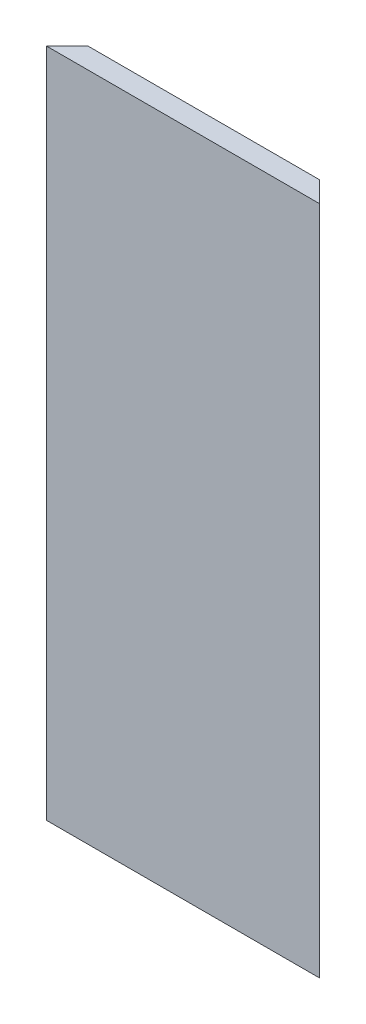
ISO-10303-21;
HEADER;
FILE_DESCRIPTION(('STEP AP214'),'2;1');
FILE_NAME('part.step','',(''),(''),'','','');
FILE_SCHEMA(('AUTOMOTIVE_DESIGN { 1 0 10303 214 1 1 1 1 }'));
ENDSEC;
DATA;
#1=APPLICATION_CONTEXT('core data for automotive mechanical design processes');
#2=APPLICATION_PROTOCOL_DEFINITION('international standard','automotive_design',2000,#1);
#3=PRODUCT_CONTEXT('',#1,'mechanical');
#4=PRODUCT('Part','Part','',(#3));
#5=PRODUCT_RELATED_PRODUCT_CATEGORY('part','',(#4));
#6=PRODUCT_DEFINITION_FORMATION('','',#4);
#7=PRODUCT_DEFINITION_CONTEXT('part definition',#1,'design');
#8=PRODUCT_DEFINITION('design','',#6,#7);
#9=PRODUCT_DEFINITION_SHAPE('','',#8);
#10=(LENGTH_UNIT() NAMED_UNIT(*) SI_UNIT(.MILLI.,.METRE.));
#11=(NAMED_UNIT(*) PLANE_ANGLE_UNIT() SI_UNIT($,.RADIAN.));
#12=(NAMED_UNIT(*) SI_UNIT($,.STERADIAN.) SOLID_ANGLE_UNIT());
#13=UNCERTAINTY_MEASURE_WITH_UNIT(LENGTH_MEASURE(1.E-05),#10,'distance_accuracy_value','');
#14=(GEOMETRIC_REPRESENTATION_CONTEXT(3) GLOBAL_UNCERTAINTY_ASSIGNED_CONTEXT((#13)) GLOBAL_UNIT_ASSIGNED_CONTEXT((#10,
#11,#12)) REPRESENTATION_CONTEXT('',''));
#15=CARTESIAN_POINT('',(0.,0.,0.));
#16=DIRECTION('',(0.,0.,1.));
#17=DIRECTION('',(1.,0.,0.));
#18=AXIS2_PLACEMENT_3D('',#15,#16,#17);
#19=CARTESIAN_POINT('',(-11.2,55.,0.850000000000001));
#20=DIRECTION('',(-0.707106781186549,0.,-0.707106781186546));
#21=DIRECTION('',(-0.707106781186546,0.,0.707106781186549));
#22=AXIS2_PLACEMENT_3D('',#19,#20,#21);
#23=PLANE('',#22);
#24=DIRECTION('',(0.707106781186546,0.,-0.707106781186549));
#25=VECTOR('',#24,1.);
#26=CARTESIAN_POINT('',(-11.2,0.,0.850000000000001));
#27=LINE('',#26,#25);
#28=CARTESIAN_POINT('',(-11.2,0.,0.850000000000001));
#29=VERTEX_POINT('',#28);
#30=CARTESIAN_POINT('',(-9.50000000000001,0.,-0.85));
#31=VERTEX_POINT('',#30);
#32=EDGE_CURVE('E98',#29,#31,#27,.T.);
#33=ORIENTED_EDGE('',*,*,#32,.F.);
#34=DIRECTION('',(0.,-1.,0.));
#35=VECTOR('',#34,1.);
#36=CARTESIAN_POINT('',(-11.2,55.,0.850000000000001));
#37=LINE('',#36,#35);
#38=CARTESIAN_POINT('',(-11.2,55.,0.850000000000001));
#39=VERTEX_POINT('',#38);
#40=EDGE_CURVE('E11',#39,#29,#37,.T.);
#41=ORIENTED_EDGE('',*,*,#40,.F.);
#42=DIRECTION('',(0.707106781186546,0.,-0.707106781186549));
#43=VECTOR('',#42,1.);
#44=CARTESIAN_POINT('',(-11.2,55.,0.850000000000001));
#45=LINE('',#44,#43);
#46=CARTESIAN_POINT('',(-9.50000000000001,55.,-0.85));
#47=VERTEX_POINT('',#46);
#48=EDGE_CURVE('E93',#39,#47,#45,.T.);
#49=ORIENTED_EDGE('',*,*,#48,.T.);
#50=DIRECTION('',(0.,-1.,0.));
#51=VECTOR('',#50,1.);
#52=CARTESIAN_POINT('',(-9.50000000000001,55.,-0.85));
#53=LINE('',#52,#51);
#54=EDGE_CURVE('E36',#47,#31,#53,.T.);
#55=ORIENTED_EDGE('',*,*,#54,.T.);
#56=EDGE_LOOP('',(#33,#41,#49,#55));
#57=FACE_BOUND('',#56,.T.);
#58=ADVANCED_FACE('F33',(#57),#23,.T.);
#59=CARTESIAN_POINT('',(-11.2,55.,0.850000000000001));
#60=DIRECTION('',(0.,0.,-1.));
#61=DIRECTION('',(-1.,0.,0.));
#62=AXIS2_PLACEMENT_3D('',#59,#60,#61);
#63=PLANE('',#62);
#64=DIRECTION('',(1.,0.,0.));
#65=VECTOR('',#64,1.);
#66=CARTESIAN_POINT('',(-11.2,0.,0.850000000000001));
#67=LINE('',#66,#65);
#68=CARTESIAN_POINT('',(11.2,0.,0.850000000000001));
#69=VERTEX_POINT('',#68);
#70=EDGE_CURVE('E66',#29,#69,#67,.T.);
#71=ORIENTED_EDGE('',*,*,#70,.T.);
#72=DIRECTION('',(0.,-1.,0.));
#73=VECTOR('',#72,1.);
#74=CARTESIAN_POINT('',(11.2,55.,0.850000000000001));
#75=LINE('',#74,#73);
#76=CARTESIAN_POINT('',(11.2,55.,0.850000000000001));
#77=VERTEX_POINT('',#76);
#78=EDGE_CURVE('E42',#77,#69,#75,.T.);
#79=ORIENTED_EDGE('',*,*,#78,.F.);
#80=DIRECTION('',(1.,0.,0.));
#81=VECTOR('',#80,1.);
#82=CARTESIAN_POINT('',(-11.2,55.,0.850000000000001));
#83=LINE('',#82,#81);
#84=EDGE_CURVE('E83',#39,#77,#83,.T.);
#85=ORIENTED_EDGE('',*,*,#84,.F.);
#86=ORIENTED_EDGE('',*,*,#40,.T.);
#87=EDGE_LOOP('',(#71,#79,#85,#86));
#88=FACE_BOUND('',#87,.T.);
#89=ADVANCED_FACE('F108',(#88),#63,.F.);
#90=CARTESIAN_POINT('',(11.2,55.,0.850000000000001));
#91=DIRECTION('',(-0.707106781186544,0.,0.707106781186552));
#92=DIRECTION('',(0.707106781186551,0.,0.707106781186544));
#93=AXIS2_PLACEMENT_3D('',#90,#91,#92);
#94=PLANE('',#93);
#95=DIRECTION('',(-0.707106781186551,0.,-0.707106781186544));
#96=VECTOR('',#95,1.);
#97=CARTESIAN_POINT('',(11.2,0.,0.850000000000001));
#98=LINE('',#97,#96);
#99=CARTESIAN_POINT('',(9.49999999999997,0.,-0.85));
#100=VERTEX_POINT('',#99);
#101=EDGE_CURVE('E90',#69,#100,#98,.T.);
#102=ORIENTED_EDGE('',*,*,#101,.T.);
#103=DIRECTION('',(0.,-1.,0.));
#104=VECTOR('',#103,1.);
#105=CARTESIAN_POINT('',(9.49999999999997,55.,-0.85));
#106=LINE('',#105,#104);
#107=CARTESIAN_POINT('',(9.49999999999997,55.,-0.85));
#108=VERTEX_POINT('',#107);
#109=EDGE_CURVE('E87',#108,#100,#106,.T.);
#110=ORIENTED_EDGE('',*,*,#109,.F.);
#111=DIRECTION('',(-0.707106781186551,0.,-0.707106781186544));
#112=VECTOR('',#111,1.);
#113=CARTESIAN_POINT('',(11.2,55.,0.850000000000001));
#114=LINE('',#113,#112);
#115=EDGE_CURVE('E78',#77,#108,#114,.T.);
#116=ORIENTED_EDGE('',*,*,#115,.F.);
#117=ORIENTED_EDGE('',*,*,#78,.T.);
#118=EDGE_LOOP('',(#102,#110,#116,#117));
#119=FACE_BOUND('',#118,.T.);
#120=ADVANCED_FACE('F88',(#119),#94,.F.);
#121=CARTESIAN_POINT('',(-9.50000000000001,55.,-0.85));
#122=DIRECTION('',(0.,0.,-1.));
#123=DIRECTION('',(-1.,0.,0.));
#124=AXIS2_PLACEMENT_3D('',#121,#122,#123);
#125=PLANE('',#124);
#126=DIRECTION('',(1.,0.,0.));
#127=VECTOR('',#126,1.);
#128=CARTESIAN_POINT('',(-9.50000000000001,0.,-0.85));
#129=LINE('',#128,#127);
#130=EDGE_CURVE('E101',#31,#100,#129,.T.);
#131=ORIENTED_EDGE('',*,*,#130,.F.);
#132=ORIENTED_EDGE('',*,*,#54,.F.);
#133=DIRECTION('',(1.,0.,0.));
#134=VECTOR('',#133,1.);
#135=CARTESIAN_POINT('',(-9.50000000000001,55.,-0.85));
#136=LINE('',#135,#134);
#137=EDGE_CURVE('E82',#47,#108,#136,.T.);
#138=ORIENTED_EDGE('',*,*,#137,.T.);
#139=ORIENTED_EDGE('',*,*,#109,.T.);
#140=EDGE_LOOP('',(#131,#132,#138,#139));
#141=FACE_BOUND('',#140,.T.);
#142=ADVANCED_FACE('F92',(#141),#125,.T.);
#143=CARTESIAN_POINT('',(0.,55.,0.));
#144=DIRECTION('',(0.,1.,0.));
#145=DIRECTION('',(0.,0.,1.));
#146=AXIS2_PLACEMENT_3D('',#143,#144,#145);
#147=PLANE('',#146);
#148=ORIENTED_EDGE('',*,*,#48,.F.);
#149=ORIENTED_EDGE('',*,*,#84,.T.);
#150=ORIENTED_EDGE('',*,*,#115,.T.);
#151=ORIENTED_EDGE('',*,*,#137,.F.);
#152=EDGE_LOOP('',(#148,#149,#150,#151));
#153=FACE_BOUND('',#152,.T.);
#154=ADVANCED_FACE('F81',(#153),#147,.T.);
#155=CARTESIAN_POINT('',(0.,0.,0.));
#156=DIRECTION('',(0.,1.,0.));
#157=DIRECTION('',(0.,0.,1.));
#158=AXIS2_PLACEMENT_3D('',#155,#156,#157);
#159=PLANE('',#158);
#160=ORIENTED_EDGE('',*,*,#32,.T.);
#161=ORIENTED_EDGE('',*,*,#130,.T.);
#162=ORIENTED_EDGE('',*,*,#101,.F.);
#163=ORIENTED_EDGE('',*,*,#70,.F.);
#164=EDGE_LOOP('',(#160,#161,#162,#163));
#165=FACE_BOUND('',#164,.T.);
#166=ADVANCED_FACE('F106',(#165),#159,.F.);
#167=CLOSED_SHELL('',(#58,#89,#120,#142,#154,#166));
#168=MANIFOLD_SOLID_BREP('B2',#167);
#169=ADVANCED_BREP_SHAPE_REPRESENTATION('',(#18,#168),#14);
#170=SHAPE_DEFINITION_REPRESENTATION(#9,#169);
ENDSEC;
END-ISO-10303-21;
